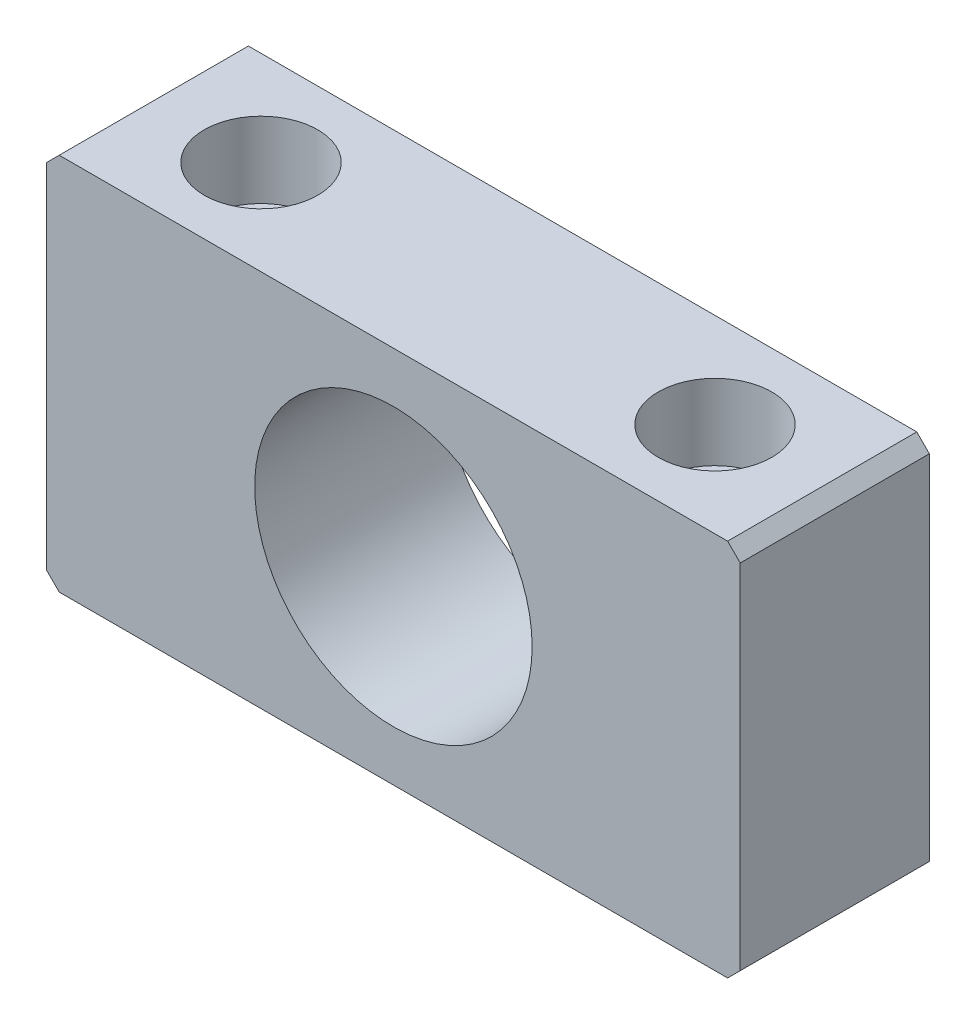
ISO-10303-21;
HEADER;
FILE_DESCRIPTION(('STEP AP214'),'2;1');
FILE_NAME('part.step','',(''),(''),'','','');
FILE_SCHEMA(('AUTOMOTIVE_DESIGN { 1 0 10303 214 1 1 1 1 }'));
ENDSEC;
DATA;
#1=APPLICATION_CONTEXT('core data for automotive mechanical design processes');
#2=APPLICATION_PROTOCOL_DEFINITION('international standard','automotive_design',2000,#1);
#3=PRODUCT_CONTEXT('',#1,'mechanical');
#4=PRODUCT('Part','Part','',(#3));
#5=PRODUCT_RELATED_PRODUCT_CATEGORY('part','',(#4));
#6=PRODUCT_DEFINITION_FORMATION('','',#4);
#7=PRODUCT_DEFINITION_CONTEXT('part definition',#1,'design');
#8=PRODUCT_DEFINITION('design','',#6,#7);
#9=PRODUCT_DEFINITION_SHAPE('','',#8);
#10=(LENGTH_UNIT() NAMED_UNIT(*) SI_UNIT(.MILLI.,.METRE.));
#11=(NAMED_UNIT(*) PLANE_ANGLE_UNIT() SI_UNIT($,.RADIAN.));
#12=(NAMED_UNIT(*) SI_UNIT($,.STERADIAN.) SOLID_ANGLE_UNIT());
#13=UNCERTAINTY_MEASURE_WITH_UNIT(LENGTH_MEASURE(1.E-05),#10,'distance_accuracy_value','');
#14=(GEOMETRIC_REPRESENTATION_CONTEXT(3) GLOBAL_UNCERTAINTY_ASSIGNED_CONTEXT((#13)) GLOBAL_UNIT_ASSIGNED_CONTEXT((#10,
#11,#12)) REPRESENTATION_CONTEXT('',''));
#15=CARTESIAN_POINT('',(0.,0.,0.));
#16=DIRECTION('',(0.,0.,1.));
#17=DIRECTION('',(1.,0.,0.));
#18=AXIS2_PLACEMENT_3D('',#15,#16,#17);
#19=CARTESIAN_POINT('',(18.,-15.,7.5));
#20=DIRECTION('',(0.,1.,0.));
#21=DIRECTION('',(0.,0.,1.));
#22=AXIS2_PLACEMENT_3D('',#19,#20,#21);
#23=CYLINDRICAL_SURFACE('',#22,2.55);
#24=CARTESIAN_POINT('',(18.,-15.,7.5));
#25=DIRECTION('',(0.,1.,0.));
#26=DIRECTION('',(0.,0.,-1.));
#27=AXIS2_PLACEMENT_3D('',#24,#25,#26);
#28=CIRCLE('',#27,2.55);
#29=CARTESIAN_POINT('',(18.,-15.,4.95));
#30=VERTEX_POINT('',#29);
#31=EDGE_CURVE('E146',#30,#30,#28,.T.);
#32=ORIENTED_EDGE('',*,*,#31,.F.);
#33=EDGE_LOOP('',(#32));
#34=FACE_BOUND('',#33,.T.);
#35=CARTESIAN_POINT('',(18.,9.,7.5));
#36=DIRECTION('',(0.,1.,0.));
#37=DIRECTION('',(0.,0.,1.));
#38=AXIS2_PLACEMENT_3D('',#35,#36,#37);
#39=CIRCLE('',#38,2.55);
#40=CARTESIAN_POINT('',(18.,9.,10.05));
#41=VERTEX_POINT('',#40);
#42=EDGE_CURVE('E142',#41,#41,#39,.F.);
#43=ORIENTED_EDGE('',*,*,#42,.F.);
#44=EDGE_LOOP('',(#43));
#45=FACE_BOUND('',#44,.T.);
#46=ADVANCED_FACE('F39',(#34,#45),#23,.F.);
#47=CARTESIAN_POINT('',(-18.,-15.,7.5));
#48=DIRECTION('',(0.,1.,0.));
#49=DIRECTION('',(0.,0.,1.));
#50=AXIS2_PLACEMENT_3D('',#47,#48,#49);
#51=CYLINDRICAL_SURFACE('',#50,2.55);
#52=CARTESIAN_POINT('',(-18.,-15.,7.5));
#53=DIRECTION('',(0.,1.,0.));
#54=DIRECTION('',(0.,0.,1.));
#55=AXIS2_PLACEMENT_3D('',#52,#53,#54);
#56=CIRCLE('',#55,2.55);
#57=CARTESIAN_POINT('',(-18.,-15.,10.05));
#58=VERTEX_POINT('',#57);
#59=EDGE_CURVE('E197',#58,#58,#56,.T.);
#60=ORIENTED_EDGE('',*,*,#59,.F.);
#61=EDGE_LOOP('',(#60));
#62=FACE_BOUND('',#61,.T.);
#63=CARTESIAN_POINT('',(-18.,9.,7.5));
#64=DIRECTION('',(0.,1.,0.));
#65=DIRECTION('',(0.,0.,1.));
#66=AXIS2_PLACEMENT_3D('',#63,#64,#65);
#67=CIRCLE('',#66,2.55);
#68=CARTESIAN_POINT('',(-18.,9.,10.05));
#69=VERTEX_POINT('',#68);
#70=EDGE_CURVE('E139',#69,#69,#67,.F.);
#71=ORIENTED_EDGE('',*,*,#70,.F.);
#72=EDGE_LOOP('',(#71));
#73=FACE_BOUND('',#72,.T.);
#74=ADVANCED_FACE('F247',(#62,#73),#51,.F.);
#75=CARTESIAN_POINT('',(0.,0.,15.));
#76=DIRECTION('',(0.,0.,1.));
#77=DIRECTION('',(1.,0.,0.));
#78=AXIS2_PLACEMENT_3D('',#75,#76,#77);
#79=PLANE('',#78);
#80=DIRECTION('',(1.,0.,0.));
#81=VECTOR('',#80,1.);
#82=CARTESIAN_POINT('',(-27.5,-15.,15.));
#83=LINE('',#82,#81);
#84=CARTESIAN_POINT('',(-26.5,-15.,15.));
#85=VERTEX_POINT('',#84);
#86=CARTESIAN_POINT('',(26.5,-15.,15.));
#87=VERTEX_POINT('',#86);
#88=EDGE_CURVE('E183',#85,#87,#83,.T.);
#89=ORIENTED_EDGE('',*,*,#88,.T.);
#90=DIRECTION('',(-0.70710678118655,-0.707106781186545,0.));
#91=VECTOR('',#90,1.);
#92=CARTESIAN_POINT('',(20.7499999999999,-20.75,15.));
#93=LINE('',#92,#91);
#94=CARTESIAN_POINT('',(27.5,-14.,15.));
#95=VERTEX_POINT('',#94);
#96=EDGE_CURVE('E161',#87,#95,#93,.F.);
#97=ORIENTED_EDGE('',*,*,#96,.T.);
#98=DIRECTION('',(0.,1.,0.));
#99=VECTOR('',#98,1.);
#100=CARTESIAN_POINT('',(27.5,15.,15.));
#101=LINE('',#100,#99);
#102=CARTESIAN_POINT('',(27.5,14.,15.));
#103=VERTEX_POINT('',#102);
#104=EDGE_CURVE('E123',#95,#103,#101,.T.);
#105=ORIENTED_EDGE('',*,*,#104,.T.);
#106=DIRECTION('',(0.707106781186545,-0.70710678118655,0.));
#107=VECTOR('',#106,1.);
#108=CARTESIAN_POINT('',(20.7500000000001,20.75,15.));
#109=LINE('',#108,#107);
#110=CARTESIAN_POINT('',(26.5,15.,15.));
#111=VERTEX_POINT('',#110);
#112=EDGE_CURVE('E59',#103,#111,#109,.F.);
#113=ORIENTED_EDGE('',*,*,#112,.T.);
#114=DIRECTION('',(-1.,0.,0.));
#115=VECTOR('',#114,1.);
#116=CARTESIAN_POINT('',(-27.5,15.,15.));
#117=LINE('',#116,#115);
#118=CARTESIAN_POINT('',(-26.5,15.,15.));
#119=VERTEX_POINT('',#118);
#120=EDGE_CURVE('E147',#111,#119,#117,.T.);
#121=ORIENTED_EDGE('',*,*,#120,.T.);
#122=DIRECTION('',(0.70710678118655,0.707106781186545,0.));
#123=VECTOR('',#122,1.);
#124=CARTESIAN_POINT('',(-20.7499999999999,20.75,15.));
#125=LINE('',#124,#123);
#126=CARTESIAN_POINT('',(-27.5,14.,15.));
#127=VERTEX_POINT('',#126);
#128=EDGE_CURVE('E157',#119,#127,#125,.F.);
#129=ORIENTED_EDGE('',*,*,#128,.T.);
#130=DIRECTION('',(0.,-1.,0.));
#131=VECTOR('',#130,1.);
#132=CARTESIAN_POINT('',(-27.5,15.,15.));
#133=LINE('',#132,#131);
#134=CARTESIAN_POINT('',(-27.5,-14.,15.));
#135=VERTEX_POINT('',#134);
#136=EDGE_CURVE('E133',#127,#135,#133,.T.);
#137=ORIENTED_EDGE('',*,*,#136,.T.);
#138=DIRECTION('',(-0.707106781186545,0.70710678118655,0.));
#139=VECTOR('',#138,1.);
#140=CARTESIAN_POINT('',(-20.7500000000001,-20.75,15.));
#141=LINE('',#140,#139);
#142=EDGE_CURVE('E159',#135,#85,#141,.F.);
#143=ORIENTED_EDGE('',*,*,#142,.T.);
#144=EDGE_LOOP('',(#89,#97,#105,#113,#121,#129,#137,#143));
#145=FACE_BOUND('',#144,.T.);
#146=CARTESIAN_POINT('',(0.,0.,15.));
#147=DIRECTION('',(0.,0.,1.));
#148=DIRECTION('',(1.,0.,0.));
#149=AXIS2_PLACEMENT_3D('',#146,#147,#148);
#150=CIRCLE('',#149,11.);
#151=CARTESIAN_POINT('',(11.,0.,15.));
#152=VERTEX_POINT('',#151);
#153=EDGE_CURVE('E192',#152,#152,#150,.T.);
#154=ORIENTED_EDGE('',*,*,#153,.F.);
#155=EDGE_LOOP('',(#154));
#156=FACE_BOUND('',#155,.T.);
#157=ADVANCED_FACE('F254',(#145,#156),#79,.T.);
#158=CARTESIAN_POINT('',(0.,0.,0.));
#159=DIRECTION('',(0.,0.,1.));
#160=DIRECTION('',(1.,0.,0.));
#161=AXIS2_PLACEMENT_3D('',#158,#159,#160);
#162=PLANE('',#161);
#163=DIRECTION('',(0.,1.,0.));
#164=VECTOR('',#163,1.);
#165=CARTESIAN_POINT('',(27.5,15.,0.));
#166=LINE('',#165,#164);
#167=CARTESIAN_POINT('',(27.5,-14.,0.));
#168=VERTEX_POINT('',#167);
#169=CARTESIAN_POINT('',(27.5,14.,0.));
#170=VERTEX_POINT('',#169);
#171=EDGE_CURVE('E121',#168,#170,#166,.T.);
#172=ORIENTED_EDGE('',*,*,#171,.F.);
#173=DIRECTION('',(0.70710678118655,0.707106781186545,0.));
#174=VECTOR('',#173,1.);
#175=CARTESIAN_POINT('',(27.5,-14.,0.));
#176=LINE('',#175,#174);
#177=CARTESIAN_POINT('',(26.5,-15.,0.));
#178=VERTEX_POINT('',#177);
#179=EDGE_CURVE('E104',#168,#178,#176,.F.);
#180=ORIENTED_EDGE('',*,*,#179,.T.);
#181=DIRECTION('',(1.,0.,0.));
#182=VECTOR('',#181,1.);
#183=CARTESIAN_POINT('',(-27.5,-15.,0.));
#184=LINE('',#183,#182);
#185=CARTESIAN_POINT('',(-26.5,-15.,0.));
#186=VERTEX_POINT('',#185);
#187=EDGE_CURVE('E131',#186,#178,#184,.T.);
#188=ORIENTED_EDGE('',*,*,#187,.F.);
#189=DIRECTION('',(0.707106781186545,-0.70710678118655,0.));
#190=VECTOR('',#189,1.);
#191=CARTESIAN_POINT('',(-26.5,-15.,0.));
#192=LINE('',#191,#190);
#193=CARTESIAN_POINT('',(-27.5,-14.,0.));
#194=VERTEX_POINT('',#193);
#195=EDGE_CURVE('E115',#186,#194,#192,.F.);
#196=ORIENTED_EDGE('',*,*,#195,.T.);
#197=DIRECTION('',(0.,-1.,0.));
#198=VECTOR('',#197,1.);
#199=CARTESIAN_POINT('',(-27.5,15.,0.));
#200=LINE('',#199,#198);
#201=CARTESIAN_POINT('',(-27.5,14.,0.));
#202=VERTEX_POINT('',#201);
#203=EDGE_CURVE('E135',#202,#194,#200,.T.);
#204=ORIENTED_EDGE('',*,*,#203,.F.);
#205=DIRECTION('',(-0.70710678118655,-0.707106781186545,0.));
#206=VECTOR('',#205,1.);
#207=CARTESIAN_POINT('',(-27.5,14.,0.));
#208=LINE('',#207,#206);
#209=CARTESIAN_POINT('',(-26.5,15.,0.));
#210=VERTEX_POINT('',#209);
#211=EDGE_CURVE('E150',#202,#210,#208,.F.);
#212=ORIENTED_EDGE('',*,*,#211,.T.);
#213=DIRECTION('',(-1.,0.,0.));
#214=VECTOR('',#213,1.);
#215=CARTESIAN_POINT('',(-27.5,15.,0.));
#216=LINE('',#215,#214);
#217=CARTESIAN_POINT('',(26.5,15.,0.));
#218=VERTEX_POINT('',#217);
#219=EDGE_CURVE('E130',#218,#210,#216,.T.);
#220=ORIENTED_EDGE('',*,*,#219,.F.);
#221=DIRECTION('',(-0.707106781186545,0.70710678118655,0.));
#222=VECTOR('',#221,1.);
#223=CARTESIAN_POINT('',(26.5,15.,0.));
#224=LINE('',#223,#222);
#225=EDGE_CURVE('E124',#218,#170,#224,.F.);
#226=ORIENTED_EDGE('',*,*,#225,.T.);
#227=EDGE_LOOP('',(#172,#180,#188,#196,#204,#212,#220,#226));
#228=FACE_BOUND('',#227,.T.);
#229=CARTESIAN_POINT('',(0.,0.,0.));
#230=DIRECTION('',(0.,0.,1.));
#231=DIRECTION('',(1.,0.,0.));
#232=AXIS2_PLACEMENT_3D('',#229,#230,#231);
#233=CIRCLE('',#232,11.);
#234=CARTESIAN_POINT('',(11.,0.,0.));
#235=VERTEX_POINT('',#234);
#236=EDGE_CURVE('E188',#235,#235,#233,.T.);
#237=ORIENTED_EDGE('',*,*,#236,.T.);
#238=EDGE_LOOP('',(#237));
#239=FACE_BOUND('',#238,.T.);
#240=ADVANCED_FACE('F127',(#228,#239),#162,.F.);
#241=CARTESIAN_POINT('',(-27.5,15.,15.));
#242=DIRECTION('',(1.,0.,0.));
#243=DIRECTION('',(0.,0.,-1.));
#244=AXIS2_PLACEMENT_3D('',#241,#242,#243);
#245=PLANE('',#244);
#246=ORIENTED_EDGE('',*,*,#203,.T.);
#247=DIRECTION('',(0.,0.,1.));
#248=VECTOR('',#247,1.);
#249=CARTESIAN_POINT('',(-27.5,-14.,15.));
#250=LINE('',#249,#248);
#251=EDGE_CURVE('E166',#194,#135,#250,.T.);
#252=ORIENTED_EDGE('',*,*,#251,.T.);
#253=ORIENTED_EDGE('',*,*,#136,.F.);
#254=DIRECTION('',(0.,0.,-1.));
#255=VECTOR('',#254,1.);
#256=CARTESIAN_POINT('',(-27.5,14.,15.));
#257=LINE('',#256,#255);
#258=EDGE_CURVE('E163',#127,#202,#257,.T.);
#259=ORIENTED_EDGE('',*,*,#258,.T.);
#260=EDGE_LOOP('',(#246,#252,#253,#259));
#261=FACE_BOUND('',#260,.T.);
#262=ADVANCED_FACE('F179',(#261),#245,.F.);
#263=CARTESIAN_POINT('',(-27.5,-15.,15.));
#264=DIRECTION('',(0.,1.,0.));
#265=DIRECTION('',(0.,0.,1.));
#266=AXIS2_PLACEMENT_3D('',#263,#264,#265);
#267=PLANE('',#266);
#268=ORIENTED_EDGE('',*,*,#59,.T.);
#269=EDGE_LOOP('',(#268));
#270=FACE_BOUND('',#269,.T.);
#271=ORIENTED_EDGE('',*,*,#31,.T.);
#272=EDGE_LOOP('',(#271));
#273=FACE_BOUND('',#272,.T.);
#274=ORIENTED_EDGE('',*,*,#187,.T.);
#275=DIRECTION('',(0.,0.,1.));
#276=VECTOR('',#275,1.);
#277=CARTESIAN_POINT('',(26.5,-15.,15.));
#278=LINE('',#277,#276);
#279=EDGE_CURVE('E109',#178,#87,#278,.T.);
#280=ORIENTED_EDGE('',*,*,#279,.T.);
#281=ORIENTED_EDGE('',*,*,#88,.F.);
#282=DIRECTION('',(0.,0.,-1.));
#283=VECTOR('',#282,1.);
#284=CARTESIAN_POINT('',(-26.5,-15.,15.));
#285=LINE('',#284,#283);
#286=EDGE_CURVE('E114',#85,#186,#285,.T.);
#287=ORIENTED_EDGE('',*,*,#286,.T.);
#288=EDGE_LOOP('',(#274,#280,#281,#287));
#289=FACE_BOUND('',#288,.T.);
#290=ADVANCED_FACE('F265',(#270,#273,#289),#267,.F.);
#291=CARTESIAN_POINT('',(27.5,15.,15.));
#292=DIRECTION('',(-1.,0.,0.));
#293=DIRECTION('',(0.,0.,1.));
#294=AXIS2_PLACEMENT_3D('',#291,#292,#293);
#295=PLANE('',#294);
#296=ORIENTED_EDGE('',*,*,#104,.F.);
#297=DIRECTION('',(0.,0.,-1.));
#298=VECTOR('',#297,1.);
#299=CARTESIAN_POINT('',(27.5,-14.,15.));
#300=LINE('',#299,#298);
#301=EDGE_CURVE('E108',#95,#168,#300,.T.);
#302=ORIENTED_EDGE('',*,*,#301,.T.);
#303=ORIENTED_EDGE('',*,*,#171,.T.);
#304=DIRECTION('',(0.,0.,1.));
#305=VECTOR('',#304,1.);
#306=CARTESIAN_POINT('',(27.5,14.,15.));
#307=LINE('',#306,#305);
#308=EDGE_CURVE('E125',#170,#103,#307,.T.);
#309=ORIENTED_EDGE('',*,*,#308,.T.);
#310=EDGE_LOOP('',(#296,#302,#303,#309));
#311=FACE_BOUND('',#310,.T.);
#312=ADVANCED_FACE('F120',(#311),#295,.F.);
#313=CARTESIAN_POINT('',(-27.5,15.,15.));
#314=DIRECTION('',(0.,-1.,0.));
#315=DIRECTION('',(0.,0.,-1.));
#316=AXIS2_PLACEMENT_3D('',#313,#314,#315);
#317=PLANE('',#316);
#318=CARTESIAN_POINT('',(-18.,15.,7.5));
#319=DIRECTION('',(0.,1.,0.));
#320=DIRECTION('',(0.,0.,1.));
#321=AXIS2_PLACEMENT_3D('',#318,#319,#320);
#322=CIRCLE('',#321,4.5);
#323=CARTESIAN_POINT('',(-18.,15.,12.));
#324=VERTEX_POINT('',#323);
#325=EDGE_CURVE('E209',#324,#324,#322,.T.);
#326=ORIENTED_EDGE('',*,*,#325,.F.);
#327=EDGE_LOOP('',(#326));
#328=FACE_BOUND('',#327,.T.);
#329=CARTESIAN_POINT('',(18.,15.,7.5));
#330=DIRECTION('',(0.,1.,0.));
#331=DIRECTION('',(0.,0.,1.));
#332=AXIS2_PLACEMENT_3D('',#329,#330,#331);
#333=CIRCLE('',#332,4.5);
#334=CARTESIAN_POINT('',(18.,15.,12.));
#335=VERTEX_POINT('',#334);
#336=EDGE_CURVE('E203',#335,#335,#333,.T.);
#337=ORIENTED_EDGE('',*,*,#336,.F.);
#338=EDGE_LOOP('',(#337));
#339=FACE_BOUND('',#338,.T.);
#340=ORIENTED_EDGE('',*,*,#219,.T.);
#341=DIRECTION('',(0.,0.,1.));
#342=VECTOR('',#341,1.);
#343=CARTESIAN_POINT('',(-26.5,15.,15.));
#344=LINE('',#343,#342);
#345=EDGE_CURVE('E11',#210,#119,#344,.T.);
#346=ORIENTED_EDGE('',*,*,#345,.T.);
#347=ORIENTED_EDGE('',*,*,#120,.F.);
#348=DIRECTION('',(0.,0.,-1.));
#349=VECTOR('',#348,1.);
#350=CARTESIAN_POINT('',(26.5,15.,15.));
#351=LINE('',#350,#349);
#352=EDGE_CURVE('E47',#111,#218,#351,.T.);
#353=ORIENTED_EDGE('',*,*,#352,.T.);
#354=EDGE_LOOP('',(#340,#346,#347,#353));
#355=FACE_BOUND('',#354,.T.);
#356=ADVANCED_FACE('F169',(#328,#339,#355),#317,.F.);
#357=CARTESIAN_POINT('',(0.,0.,15.));
#358=DIRECTION('',(0.,0.,-1.));
#359=DIRECTION('',(-1.,0.,0.));
#360=AXIS2_PLACEMENT_3D('',#357,#358,#359);
#361=CYLINDRICAL_SURFACE('',#360,11.);
#362=ORIENTED_EDGE('',*,*,#153,.T.);
#363=EDGE_LOOP('',(#362));
#364=FACE_BOUND('',#363,.T.);
#365=ORIENTED_EDGE('',*,*,#236,.F.);
#366=EDGE_LOOP('',(#365));
#367=FACE_BOUND('',#366,.T.);
#368=ADVANCED_FACE('F227',(#364,#367),#361,.F.);
#369=CARTESIAN_POINT('',(-18.,9.,7.5));
#370=DIRECTION('',(0.,1.,0.));
#371=DIRECTION('',(0.,0.,1.));
#372=AXIS2_PLACEMENT_3D('',#369,#370,#371);
#373=PLANE('',#372);
#374=CARTESIAN_POINT('',(-18.,9.,7.5));
#375=DIRECTION('',(0.,1.,0.));
#376=DIRECTION('',(0.,0.,1.));
#377=AXIS2_PLACEMENT_3D('',#374,#375,#376);
#378=CIRCLE('',#377,4.5);
#379=CARTESIAN_POINT('',(-18.,9.,12.));
#380=VERTEX_POINT('',#379);
#381=EDGE_CURVE('E143',#380,#380,#378,.T.);
#382=ORIENTED_EDGE('',*,*,#381,.T.);
#383=EDGE_LOOP('',(#382));
#384=FACE_BOUND('',#383,.T.);
#385=ORIENTED_EDGE('',*,*,#70,.T.);
#386=EDGE_LOOP('',(#385));
#387=FACE_BOUND('',#386,.T.);
#388=ADVANCED_FACE('F215',(#384,#387),#373,.T.);
#389=CARTESIAN_POINT('',(-18.,9.,7.5));
#390=DIRECTION('',(0.,1.,0.));
#391=DIRECTION('',(0.,0.,1.));
#392=AXIS2_PLACEMENT_3D('',#389,#390,#391);
#393=CYLINDRICAL_SURFACE('',#392,4.5);
#394=ORIENTED_EDGE('',*,*,#381,.F.);
#395=EDGE_LOOP('',(#394));
#396=FACE_BOUND('',#395,.T.);
#397=ORIENTED_EDGE('',*,*,#325,.T.);
#398=EDGE_LOOP('',(#397));
#399=FACE_BOUND('',#398,.T.);
#400=ADVANCED_FACE('F218',(#396,#399),#393,.F.);
#401=CARTESIAN_POINT('',(18.,9.,7.5));
#402=DIRECTION('',(0.,1.,0.));
#403=DIRECTION('',(0.,0.,1.));
#404=AXIS2_PLACEMENT_3D('',#401,#402,#403);
#405=PLANE('',#404);
#406=CARTESIAN_POINT('',(18.,9.,7.5));
#407=DIRECTION('',(0.,1.,0.));
#408=DIRECTION('',(0.,0.,1.));
#409=AXIS2_PLACEMENT_3D('',#406,#407,#408);
#410=CIRCLE('',#409,4.5);
#411=CARTESIAN_POINT('',(18.,9.,12.));
#412=VERTEX_POINT('',#411);
#413=EDGE_CURVE('E206',#412,#412,#410,.T.);
#414=ORIENTED_EDGE('',*,*,#413,.T.);
#415=EDGE_LOOP('',(#414));
#416=FACE_BOUND('',#415,.T.);
#417=ORIENTED_EDGE('',*,*,#42,.T.);
#418=EDGE_LOOP('',(#417));
#419=FACE_BOUND('',#418,.T.);
#420=ADVANCED_FACE('F221',(#416,#419),#405,.T.);
#421=CARTESIAN_POINT('',(18.,9.,7.5));
#422=DIRECTION('',(0.,1.,0.));
#423=DIRECTION('',(0.,0.,1.));
#424=AXIS2_PLACEMENT_3D('',#421,#422,#423);
#425=CYLINDRICAL_SURFACE('',#424,4.5);
#426=ORIENTED_EDGE('',*,*,#413,.F.);
#427=EDGE_LOOP('',(#426));
#428=FACE_BOUND('',#427,.T.);
#429=ORIENTED_EDGE('',*,*,#336,.T.);
#430=EDGE_LOOP('',(#429));
#431=FACE_BOUND('',#430,.T.);
#432=ADVANCED_FACE('F231',(#428,#431),#425,.F.);
#433=CARTESIAN_POINT('',(27.5,-14.,15.));
#434=DIRECTION('',(-0.707106781186545,0.70710678118655,0.));
#435=DIRECTION('',(0.,0.,-1.));
#436=AXIS2_PLACEMENT_3D('',#433,#434,#435);
#437=PLANE('',#436);
#438=ORIENTED_EDGE('',*,*,#96,.F.);
#439=ORIENTED_EDGE('',*,*,#279,.F.);
#440=ORIENTED_EDGE('',*,*,#179,.F.);
#441=ORIENTED_EDGE('',*,*,#301,.F.);
#442=EDGE_LOOP('',(#438,#439,#440,#441));
#443=FACE_BOUND('',#442,.T.);
#444=ADVANCED_FACE('F107',(#443),#437,.F.);
#445=CARTESIAN_POINT('',(-26.5,-15.,15.));
#446=DIRECTION('',(0.70710678118655,0.707106781186545,0.));
#447=DIRECTION('',(0.,0.,-1.));
#448=AXIS2_PLACEMENT_3D('',#445,#446,#447);
#449=PLANE('',#448);
#450=ORIENTED_EDGE('',*,*,#142,.F.);
#451=ORIENTED_EDGE('',*,*,#251,.F.);
#452=ORIENTED_EDGE('',*,*,#195,.F.);
#453=ORIENTED_EDGE('',*,*,#286,.F.);
#454=EDGE_LOOP('',(#450,#451,#452,#453));
#455=FACE_BOUND('',#454,.T.);
#456=ADVANCED_FACE('F240',(#455),#449,.F.);
#457=CARTESIAN_POINT('',(-27.5,14.,15.));
#458=DIRECTION('',(0.707106781186545,-0.70710678118655,0.));
#459=DIRECTION('',(0.,0.,-1.));
#460=AXIS2_PLACEMENT_3D('',#457,#458,#459);
#461=PLANE('',#460);
#462=ORIENTED_EDGE('',*,*,#128,.F.);
#463=ORIENTED_EDGE('',*,*,#345,.F.);
#464=ORIENTED_EDGE('',*,*,#211,.F.);
#465=ORIENTED_EDGE('',*,*,#258,.F.);
#466=EDGE_LOOP('',(#462,#463,#464,#465));
#467=FACE_BOUND('',#466,.T.);
#468=ADVANCED_FACE('F176',(#467),#461,.F.);
#469=CARTESIAN_POINT('',(26.5,15.,15.));
#470=DIRECTION('',(-0.70710678118655,-0.707106781186545,0.));
#471=DIRECTION('',(0.,0.,-1.));
#472=AXIS2_PLACEMENT_3D('',#469,#470,#471);
#473=PLANE('',#472);
#474=ORIENTED_EDGE('',*,*,#112,.F.);
#475=ORIENTED_EDGE('',*,*,#308,.F.);
#476=ORIENTED_EDGE('',*,*,#225,.F.);
#477=ORIENTED_EDGE('',*,*,#352,.F.);
#478=EDGE_LOOP('',(#474,#475,#476,#477));
#479=FACE_BOUND('',#478,.T.);
#480=ADVANCED_FACE('F41',(#479),#473,.F.);
#481=CLOSED_SHELL('',(#46,#74,#157,#240,#262,#290,#312,#356,#368,#388,#400,#420,#432,#444,#456,
#468,#480));
#482=MANIFOLD_SOLID_BREP('B2',#481);
#483=ADVANCED_BREP_SHAPE_REPRESENTATION('',(#18,#482),#14);
#484=SHAPE_DEFINITION_REPRESENTATION(#9,#483);
ENDSEC;
END-ISO-10303-21;
